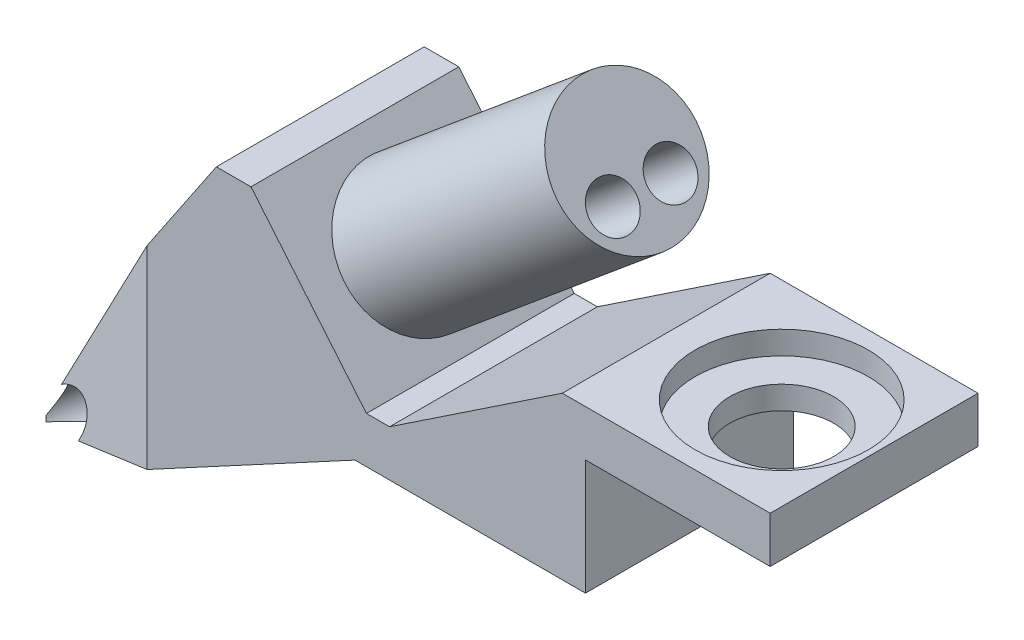
ISO-10303-21;
HEADER;
FILE_DESCRIPTION(('STEP AP214'),'2;1');
FILE_NAME('part.step','',(''),(''),'','','');
FILE_SCHEMA(('AUTOMOTIVE_DESIGN { 1 0 10303 214 1 1 1 1 }'));
ENDSEC;
DATA;
#1=APPLICATION_CONTEXT('core data for automotive mechanical design processes');
#2=APPLICATION_PROTOCOL_DEFINITION('international standard','automotive_design',2000,#1);
#3=PRODUCT_CONTEXT('',#1,'mechanical');
#4=PRODUCT('Part','Part','',(#3));
#5=PRODUCT_RELATED_PRODUCT_CATEGORY('part','',(#4));
#6=PRODUCT_DEFINITION_FORMATION('','',#4);
#7=PRODUCT_DEFINITION_CONTEXT('part definition',#1,'design');
#8=PRODUCT_DEFINITION('design','',#6,#7);
#9=PRODUCT_DEFINITION_SHAPE('','',#8);
#10=(LENGTH_UNIT() NAMED_UNIT(*) SI_UNIT(.MILLI.,.METRE.));
#11=(NAMED_UNIT(*) PLANE_ANGLE_UNIT() SI_UNIT($,.RADIAN.));
#12=(NAMED_UNIT(*) SI_UNIT($,.STERADIAN.) SOLID_ANGLE_UNIT());
#13=UNCERTAINTY_MEASURE_WITH_UNIT(LENGTH_MEASURE(1.E-05),#10,'distance_accuracy_value','');
#14=(GEOMETRIC_REPRESENTATION_CONTEXT(3) GLOBAL_UNCERTAINTY_ASSIGNED_CONTEXT((#13)) GLOBAL_UNIT_ASSIGNED_CONTEXT((#10,
#11,#12)) REPRESENTATION_CONTEXT('',''));
#15=CARTESIAN_POINT('',(0.,0.,0.));
#16=DIRECTION('',(0.,0.,1.));
#17=DIRECTION('',(1.,0.,0.));
#18=AXIS2_PLACEMENT_3D('',#15,#16,#17);
#19=CARTESIAN_POINT('',(31.6,0.,4.5));
#20=DIRECTION('',(0.,1.,0.));
#21=DIRECTION('',(0.,0.,1.));
#22=AXIS2_PLACEMENT_3D('',#19,#20,#21);
#23=CYLINDRICAL_SURFACE('',#22,2.25);
#24=CARTESIAN_POINT('',(31.6,14.5,4.5));
#25=DIRECTION('',(0.,1.,0.));
#26=DIRECTION('',(0.,0.,1.));
#27=AXIS2_PLACEMENT_3D('',#24,#25,#26);
#28=CIRCLE('',#27,2.25);
#29=CARTESIAN_POINT('',(31.6,14.5,6.75));
#30=VERTEX_POINT('',#29);
#31=EDGE_CURVE('E229',#30,#30,#28,.T.);
#32=ORIENTED_EDGE('',*,*,#31,.F.);
#33=EDGE_LOOP('',(#32));
#34=FACE_BOUND('',#33,.T.);
#35=CARTESIAN_POINT('',(31.6,15.5,4.5));
#36=DIRECTION('',(0.,1.,0.));
#37=DIRECTION('',(0.,0.,1.));
#38=AXIS2_PLACEMENT_3D('',#35,#36,#37);
#39=CIRCLE('',#38,2.25);
#40=CARTESIAN_POINT('',(31.6,15.5,6.75));
#41=VERTEX_POINT('',#40);
#42=EDGE_CURVE('E212',#41,#41,#39,.T.);
#43=ORIENTED_EDGE('',*,*,#42,.T.);
#44=EDGE_LOOP('',(#43));
#45=FACE_BOUND('',#44,.T.);
#46=ADVANCED_FACE('F48',(#34,#45),#23,.F.);
#47=CARTESIAN_POINT('',(0.,0.,9.));
#48=DIRECTION('',(1.,0.,0.));
#49=DIRECTION('',(0.,0.,-1.));
#50=AXIS2_PLACEMENT_3D('',#47,#48,#49);
#51=PLANE('',#50);
#52=DIRECTION('',(0.,0.,-1.));
#53=VECTOR('',#52,1.);
#54=CARTESIAN_POINT('',(0.,0.,9.));
#55=LINE('',#54,#53);
#56=CARTESIAN_POINT('',(0.,0.,4.75109455568454));
#57=VERTEX_POINT('',#56);
#58=CARTESIAN_POINT('',(0.,0.,4.24890544431546));
#59=VERTEX_POINT('',#58);
#60=EDGE_CURVE('E174',#57,#59,#55,.T.);
#61=ORIENTED_EDGE('',*,*,#60,.F.);
#62=CARTESIAN_POINT('',(0.,0.0608875813676938,5.75));
#63=DIRECTION('',(1.,0.,0.));
#64=DIRECTION('',(0.,1.,0.));
#65=AXIS2_PLACEMENT_3D('',#62,#63,#64);
#66=ELLIPSE('',#65,1.30170827931778,1.);
#67=CARTESIAN_POINT('',(0.,0.25,4.76060944613856));
#68=VERTEX_POINT('',#67);
#69=EDGE_CURVE('E206',#57,#68,#66,.T.);
#70=ORIENTED_EDGE('',*,*,#69,.T.);
#71=DIRECTION('',(0.,0.,-1.));
#72=VECTOR('',#71,1.);
#73=CARTESIAN_POINT('',(0.,0.25,9.));
#74=LINE('',#73,#72);
#75=CARTESIAN_POINT('',(0.,0.25,4.23939055386144));
#76=VERTEX_POINT('',#75);
#77=EDGE_CURVE('E176',#68,#76,#74,.T.);
#78=ORIENTED_EDGE('',*,*,#77,.T.);
#79=CARTESIAN_POINT('',(0.,0.0608875813676938,3.25));
#80=DIRECTION('',(1.,0.,0.));
#81=DIRECTION('',(0.,1.,0.));
#82=AXIS2_PLACEMENT_3D('',#79,#80,#81);
#83=ELLIPSE('',#82,1.30170827931778,1.);
#84=EDGE_CURVE('E164',#76,#59,#83,.T.);
#85=ORIENTED_EDGE('',*,*,#84,.T.);
#86=EDGE_LOOP('',(#61,#70,#78,#85));
#87=FACE_BOUND('',#86,.T.);
#88=ADVANCED_FACE('F50',(#87),#51,.F.);
#89=CARTESIAN_POINT('',(0.,0.,9.));
#90=DIRECTION('',(-0.474645573053964,0.880177016275859,0.));
#91=DIRECTION('',(-0.880177016275859,-0.474645573053964,0.));
#92=AXIS2_PLACEMENT_3D('',#89,#90,#91);
#93=PLANE('',#92);
#94=DIRECTION('',(0.814787559864974,0.439383557077732,0.378237124115283));
#95=VECTOR('',#94,1.);
#96=CARTESIAN_POINT('',(1.23273161363295,0.664764692050499,5.572253288236));
#97=LINE('',#96,#95);
#98=CARTESIAN_POINT('',(3.06593965426161,1.65334319942045,6.42325712205412));
#99=VERTEX_POINT('',#98);
#100=CARTESIAN_POINT('',(8.61668522645211,4.64664655121279,9.));
#101=VERTEX_POINT('',#100);
#102=EDGE_CURVE('E227',#99,#101,#97,.T.);
#103=ORIENTED_EDGE('',*,*,#102,.F.);
#104=CARTESIAN_POINT('',(-0.207050024136444,-0.111654105412676,5.75));
#105=DIRECTION('',(-0.474645573053964,0.880177016275859,0.));
#106=DIRECTION('',(0.880177016275859,0.474645573053964,0.));
#107=AXIS2_PLACEMENT_3D('',#104,#105,#106);
#108=ELLIPSE('',#107,5.02909924135544,1.);
#109=EDGE_CURVE('E73',#99,#57,#108,.T.);
#110=ORIENTED_EDGE('',*,*,#109,.T.);
#111=ORIENTED_EDGE('',*,*,#60,.T.);
#112=CARTESIAN_POINT('',(-0.207050024136444,-0.111654105412676,3.25));
#113=DIRECTION('',(-0.474645573053964,0.880177016275859,0.));
#114=DIRECTION('',(0.880177016275859,0.474645573053964,0.));
#115=AXIS2_PLACEMENT_3D('',#112,#113,#114);
#116=ELLIPSE('',#115,5.02909924135545,1.);
#117=CARTESIAN_POINT('',(3.06593965426161,1.65334319942045,2.57674287794588));
#118=VERTEX_POINT('',#117);
#119=EDGE_CURVE('E161',#59,#118,#116,.T.);
#120=ORIENTED_EDGE('',*,*,#119,.T.);
#121=DIRECTION('',(0.814787559864974,0.439383557077732,-0.378237124115283));
#122=VECTOR('',#121,1.);
#123=CARTESIAN_POINT('',(-1.54091451704119,-0.830955865063124,4.715316610295));
#124=LINE('',#123,#122);
#125=CARTESIAN_POINT('',(8.61668522645211,4.64664655121279,0.));
#126=VERTEX_POINT('',#125);
#127=EDGE_CURVE('E222',#118,#126,#124,.T.);
#128=ORIENTED_EDGE('',*,*,#127,.T.);
#129=DIRECTION('',(0.880177016275859,0.474645573053964,0.));
#130=VECTOR('',#129,1.);
#131=CARTESIAN_POINT('',(0.,0.,0.));
#132=LINE('',#131,#130);
#133=CARTESIAN_POINT('',(17.6166852264521,9.5,0.));
#134=VERTEX_POINT('',#133);
#135=EDGE_CURVE('E232',#126,#134,#132,.T.);
#136=ORIENTED_EDGE('',*,*,#135,.T.);
#137=DIRECTION('',(0.,0.,-1.));
#138=VECTOR('',#137,1.);
#139=CARTESIAN_POINT('',(17.6166852264521,9.5,9.));
#140=LINE('',#139,#138);
#141=CARTESIAN_POINT('',(17.6166852264521,9.5,9.));
#142=VERTEX_POINT('',#141);
#143=EDGE_CURVE('E181',#142,#134,#140,.T.);
#144=ORIENTED_EDGE('',*,*,#143,.F.);
#145=DIRECTION('',(0.880177016275859,0.474645573053964,0.));
#146=VECTOR('',#145,1.);
#147=CARTESIAN_POINT('',(0.,0.,9.));
#148=LINE('',#147,#146);
#149=EDGE_CURVE('E233',#101,#142,#148,.T.);
#150=ORIENTED_EDGE('',*,*,#149,.F.);
#151=EDGE_LOOP('',(#103,#110,#111,#120,#128,#136,#144,#150));
#152=FACE_BOUND('',#151,.T.);
#153=ADVANCED_FACE('F179',(#152),#93,.F.);
#154=CARTESIAN_POINT('',(11.6166852264521,17.5,9.));
#155=DIRECTION('',(0.829451668795888,-0.558578489678681,0.));
#156=DIRECTION('',(0.558578489678681,0.829451668795888,0.));
#157=AXIS2_PLACEMENT_3D('',#154,#155,#156);
#158=PLANE('',#157);
#159=ORIENTED_EDGE('',*,*,#77,.F.);
#160=CARTESIAN_POINT('',(-0.29022789513742,-0.180968997913489,5.75));
#161=DIRECTION('',(0.829451668795888,-0.558578489678681,0.));
#162=DIRECTION('',(0.558578489678681,0.829451668795888,0.));
#163=AXIS2_PLACEMENT_3D('',#160,#161,#162);
#164=ELLIPSE('',#163,3.57642039485892,1.);
#165=CARTESIAN_POINT('',(1.70573518411173,2.78290257524811,5.79182894084391));
#166=VERTEX_POINT('',#165);
#167=EDGE_CURVE('E202',#68,#166,#164,.T.);
#168=ORIENTED_EDGE('',*,*,#167,.T.);
#169=DIRECTION('',(-0.540696779594401,-0.802898526230621,-0.250999898631335));
#170=VECTOR('',#169,1.);
#171=CARTESIAN_POINT('',(11.4276823791133,17.2193434225823,10.3049088269033));
#172=LINE('',#171,#170);
#173=CARTESIAN_POINT('',(8.61668522645211,13.0452008046012,9.));
#174=VERTEX_POINT('',#173);
#175=EDGE_CURVE('E224',#174,#166,#172,.T.);
#176=ORIENTED_EDGE('',*,*,#175,.F.);
#177=DIRECTION('',(-0.558578489678681,-0.829451668795888,0.));
#178=VECTOR('',#177,1.);
#179=CARTESIAN_POINT('',(11.6166852264521,17.5,9.));
#180=LINE('',#179,#178);
#181=CARTESIAN_POINT('',(11.6166852264521,17.5,9.));
#182=VERTEX_POINT('',#181);
#183=EDGE_CURVE('E254',#182,#174,#180,.T.);
#184=ORIENTED_EDGE('',*,*,#183,.F.);
#185=DIRECTION('',(0.,0.,-1.));
#186=VECTOR('',#185,1.);
#187=CARTESIAN_POINT('',(11.6166852264521,17.5,9.));
#188=LINE('',#187,#186);
#189=CARTESIAN_POINT('',(11.6166852264521,17.5,0.));
#190=VERTEX_POINT('',#189);
#191=EDGE_CURVE('E280',#182,#190,#188,.T.);
#192=ORIENTED_EDGE('',*,*,#191,.T.);
#193=DIRECTION('',(-0.558578489678681,-0.829451668795888,0.));
#194=VECTOR('',#193,1.);
#195=CARTESIAN_POINT('',(11.6166852264521,17.5,0.));
#196=LINE('',#195,#194);
#197=CARTESIAN_POINT('',(8.61668522645212,13.0452008046012,0.));
#198=VERTEX_POINT('',#197);
#199=EDGE_CURVE('E236',#190,#198,#196,.T.);
#200=ORIENTED_EDGE('',*,*,#199,.T.);
#201=DIRECTION('',(-0.540696779594401,-0.802898526230621,0.250999898631335));
#202=VECTOR('',#201,1.);
#203=CARTESIAN_POINT('',(10.2062488472969,15.4055963843261,-0.737900284886843));
#204=LINE('',#203,#202);
#205=CARTESIAN_POINT('',(1.70573518411173,2.78290257524812,3.20817105915609));
#206=VERTEX_POINT('',#205);
#207=EDGE_CURVE('E218',#198,#206,#204,.T.);
#208=ORIENTED_EDGE('',*,*,#207,.T.);
#209=CARTESIAN_POINT('',(-0.29022789513742,-0.180968997913489,3.25));
#210=DIRECTION('',(0.829451668795888,-0.558578489678681,0.));
#211=DIRECTION('',(0.558578489678681,0.829451668795888,0.));
#212=AXIS2_PLACEMENT_3D('',#209,#210,#211);
#213=ELLIPSE('',#212,3.57642039485892,1.);
#214=EDGE_CURVE('E65',#206,#76,#213,.T.);
#215=ORIENTED_EDGE('',*,*,#214,.T.);
#216=EDGE_LOOP('',(#159,#168,#176,#184,#192,#200,#208,#215));
#217=FACE_BOUND('',#216,.T.);
#218=ADVANCED_FACE('F338',(#217),#158,.F.);
#219=CARTESIAN_POINT('',(0.,0.,9.));
#220=DIRECTION('',(0.,0.,1.));
#221=DIRECTION('',(1.,0.,0.));
#222=AXIS2_PLACEMENT_3D('',#219,#220,#221);
#223=PLANE('',#222);
#224=ORIENTED_EDGE('',*,*,#183,.T.);
#225=DIRECTION('',(0.,-1.,0.));
#226=VECTOR('',#225,1.);
#227=CARTESIAN_POINT('',(8.61668522645211,0.,9.));
#228=LINE('',#227,#226);
#229=EDGE_CURVE('E57',#174,#101,#228,.T.);
#230=ORIENTED_EDGE('',*,*,#229,.T.);
#231=ORIENTED_EDGE('',*,*,#149,.T.);
#232=DIRECTION('',(1.,0.,0.));
#233=VECTOR('',#232,1.);
#234=CARTESIAN_POINT('',(17.6166852264521,9.5,9.));
#235=LINE('',#234,#233);
#236=CARTESIAN_POINT('',(27.6,9.5,9.));
#237=VERTEX_POINT('',#236);
#238=EDGE_CURVE('E235',#142,#237,#235,.T.);
#239=ORIENTED_EDGE('',*,*,#238,.T.);
#240=DIRECTION('',(0.,1.,0.));
#241=VECTOR('',#240,1.);
#242=CARTESIAN_POINT('',(27.6,9.5,9.));
#243=LINE('',#242,#241);
#244=CARTESIAN_POINT('',(27.6,14.5,9.));
#245=VERTEX_POINT('',#244);
#246=EDGE_CURVE('E238',#237,#245,#243,.T.);
#247=ORIENTED_EDGE('',*,*,#246,.T.);
#248=DIRECTION('',(1.,0.,0.));
#249=VECTOR('',#248,1.);
#250=CARTESIAN_POINT('',(27.6,14.5,9.));
#251=LINE('',#250,#249);
#252=CARTESIAN_POINT('',(35.6,14.5,9.));
#253=VERTEX_POINT('',#252);
#254=EDGE_CURVE('E240',#245,#253,#251,.T.);
#255=ORIENTED_EDGE('',*,*,#254,.T.);
#256=DIRECTION('',(0.,1.,0.));
#257=VECTOR('',#256,1.);
#258=CARTESIAN_POINT('',(35.6,14.5,9.));
#259=LINE('',#258,#257);
#260=CARTESIAN_POINT('',(35.6,16.5,9.));
#261=VERTEX_POINT('',#260);
#262=EDGE_CURVE('E242',#253,#261,#259,.T.);
#263=ORIENTED_EDGE('',*,*,#262,.T.);
#264=DIRECTION('',(-1.,0.,0.));
#265=VECTOR('',#264,1.);
#266=CARTESIAN_POINT('',(35.6,16.5,9.));
#267=LINE('',#266,#265);
#268=CARTESIAN_POINT('',(26.6,16.5,9.));
#269=VERTEX_POINT('',#268);
#270=EDGE_CURVE('E244',#261,#269,#267,.T.);
#271=ORIENTED_EDGE('',*,*,#270,.T.);
#272=DIRECTION('',(-0.831479419283098,-0.555555555555556,0.));
#273=VECTOR('',#272,1.);
#274=CARTESIAN_POINT('',(26.6,16.5,9.));
#275=LINE('',#274,#273);
#276=CARTESIAN_POINT('',(19.1166852264521,11.5,9.));
#277=VERTEX_POINT('',#276);
#278=EDGE_CURVE('E246',#269,#277,#275,.T.);
#279=ORIENTED_EDGE('',*,*,#278,.T.);
#280=DIRECTION('',(-1.,0.,0.));
#281=VECTOR('',#280,1.);
#282=CARTESIAN_POINT('',(19.1166852264521,11.5,9.));
#283=LINE('',#282,#281);
#284=CARTESIAN_POINT('',(18.1166852264521,11.5,9.));
#285=VERTEX_POINT('',#284);
#286=EDGE_CURVE('E248',#277,#285,#283,.T.);
#287=ORIENTED_EDGE('',*,*,#286,.T.);
#288=DIRECTION('',(-0.64018439966448,0.768221279597376,0.));
#289=VECTOR('',#288,1.);
#290=CARTESIAN_POINT('',(18.1166852264521,11.5,9.));
#291=LINE('',#290,#289);
#292=CARTESIAN_POINT('',(13.1166852264521,17.5,9.));
#293=VERTEX_POINT('',#292);
#294=EDGE_CURVE('E250',#285,#293,#291,.T.);
#295=ORIENTED_EDGE('',*,*,#294,.T.);
#296=DIRECTION('',(-1.,0.,0.));
#297=VECTOR('',#296,1.);
#298=CARTESIAN_POINT('',(13.1166852264521,17.5,9.));
#299=LINE('',#298,#297);
#300=EDGE_CURVE('E252',#293,#182,#299,.T.);
#301=ORIENTED_EDGE('',*,*,#300,.T.);
#302=EDGE_LOOP('',(#224,#230,#231,#239,#247,#255,#263,#271,#279,#287,#295,#301));
#303=FACE_BOUND('',#302,.T.);
#304=ADVANCED_FACE('F329',(#303),#223,.T.);
#305=CARTESIAN_POINT('',(17.6166852264521,9.5,9.));
#306=DIRECTION('',(0.,1.,0.));
#307=DIRECTION('',(0.,0.,1.));
#308=AXIS2_PLACEMENT_3D('',#305,#306,#307);
#309=PLANE('',#308);
#310=DIRECTION('',(1.,0.,0.));
#311=VECTOR('',#310,1.);
#312=CARTESIAN_POINT('',(17.6166852264521,9.5,0.));
#313=LINE('',#312,#311);
#314=CARTESIAN_POINT('',(27.6,9.5,0.));
#315=VERTEX_POINT('',#314);
#316=EDGE_CURVE('E258',#134,#315,#313,.T.);
#317=ORIENTED_EDGE('',*,*,#316,.T.);
#318=DIRECTION('',(0.,0.,-1.));
#319=VECTOR('',#318,1.);
#320=CARTESIAN_POINT('',(27.6,9.5,9.));
#321=LINE('',#320,#319);
#322=EDGE_CURVE('E186',#237,#315,#321,.T.);
#323=ORIENTED_EDGE('',*,*,#322,.F.);
#324=ORIENTED_EDGE('',*,*,#238,.F.);
#325=ORIENTED_EDGE('',*,*,#143,.T.);
#326=EDGE_LOOP('',(#317,#323,#324,#325));
#327=FACE_BOUND('',#326,.T.);
#328=ADVANCED_FACE('F333',(#327),#309,.F.);
#329=CARTESIAN_POINT('',(27.6,9.5,9.));
#330=DIRECTION('',(-1.,0.,0.));
#331=DIRECTION('',(0.,0.,1.));
#332=AXIS2_PLACEMENT_3D('',#329,#330,#331);
#333=PLANE('',#332);
#334=DIRECTION('',(0.,1.,0.));
#335=VECTOR('',#334,1.);
#336=CARTESIAN_POINT('',(27.6,9.5,0.));
#337=LINE('',#336,#335);
#338=CARTESIAN_POINT('',(27.6,14.5,0.));
#339=VERTEX_POINT('',#338);
#340=EDGE_CURVE('E260',#315,#339,#337,.T.);
#341=ORIENTED_EDGE('',*,*,#340,.T.);
#342=DIRECTION('',(0.,0.,-1.));
#343=VECTOR('',#342,1.);
#344=CARTESIAN_POINT('',(27.6,14.5,9.));
#345=LINE('',#344,#343);
#346=EDGE_CURVE('E301',#245,#339,#345,.T.);
#347=ORIENTED_EDGE('',*,*,#346,.F.);
#348=ORIENTED_EDGE('',*,*,#246,.F.);
#349=ORIENTED_EDGE('',*,*,#322,.T.);
#350=EDGE_LOOP('',(#341,#347,#348,#349));
#351=FACE_BOUND('',#350,.T.);
#352=ADVANCED_FACE('F308',(#351),#333,.F.);
#353=CARTESIAN_POINT('',(27.6,14.5,9.));
#354=DIRECTION('',(0.,1.,0.));
#355=DIRECTION('',(0.,0.,1.));
#356=AXIS2_PLACEMENT_3D('',#353,#354,#355);
#357=PLANE('',#356);
#358=ORIENTED_EDGE('',*,*,#31,.T.);
#359=EDGE_LOOP('',(#358));
#360=FACE_BOUND('',#359,.T.);
#361=DIRECTION('',(1.,0.,0.));
#362=VECTOR('',#361,1.);
#363=CARTESIAN_POINT('',(27.6,14.5,0.));
#364=LINE('',#363,#362);
#365=CARTESIAN_POINT('',(35.6,14.5,0.));
#366=VERTEX_POINT('',#365);
#367=EDGE_CURVE('E262',#339,#366,#364,.T.);
#368=ORIENTED_EDGE('',*,*,#367,.T.);
#369=DIRECTION('',(0.,0.,-1.));
#370=VECTOR('',#369,1.);
#371=CARTESIAN_POINT('',(35.6,14.5,9.));
#372=LINE('',#371,#370);
#373=EDGE_CURVE('E298',#253,#366,#372,.T.);
#374=ORIENTED_EDGE('',*,*,#373,.F.);
#375=ORIENTED_EDGE('',*,*,#254,.F.);
#376=ORIENTED_EDGE('',*,*,#346,.T.);
#377=EDGE_LOOP('',(#368,#374,#375,#376));
#378=FACE_BOUND('',#377,.T.);
#379=ADVANCED_FACE('F321',(#360,#378),#357,.F.);
#380=CARTESIAN_POINT('',(35.6,14.5,9.));
#381=DIRECTION('',(-1.,0.,0.));
#382=DIRECTION('',(0.,0.,1.));
#383=AXIS2_PLACEMENT_3D('',#380,#381,#382);
#384=PLANE('',#383);
#385=DIRECTION('',(0.,1.,0.));
#386=VECTOR('',#385,1.);
#387=CARTESIAN_POINT('',(35.6,14.5,0.));
#388=LINE('',#387,#386);
#389=CARTESIAN_POINT('',(35.6,16.5,0.));
#390=VERTEX_POINT('',#389);
#391=EDGE_CURVE('E264',#366,#390,#388,.T.);
#392=ORIENTED_EDGE('',*,*,#391,.T.);
#393=DIRECTION('',(0.,0.,-1.));
#394=VECTOR('',#393,1.);
#395=CARTESIAN_POINT('',(35.6,16.5,9.));
#396=LINE('',#395,#394);
#397=EDGE_CURVE('E295',#261,#390,#396,.T.);
#398=ORIENTED_EDGE('',*,*,#397,.F.);
#399=ORIENTED_EDGE('',*,*,#262,.F.);
#400=ORIENTED_EDGE('',*,*,#373,.T.);
#401=EDGE_LOOP('',(#392,#398,#399,#400));
#402=FACE_BOUND('',#401,.T.);
#403=ADVANCED_FACE('F325',(#402),#384,.F.);
#404=CARTESIAN_POINT('',(35.6,16.5,9.));
#405=DIRECTION('',(0.,-1.,0.));
#406=DIRECTION('',(0.,0.,-1.));
#407=AXIS2_PLACEMENT_3D('',#404,#405,#406);
#408=PLANE('',#407);
#409=CARTESIAN_POINT('',(31.6,16.5,4.5));
#410=DIRECTION('',(0.,1.,0.));
#411=DIRECTION('',(0.,0.,1.));
#412=AXIS2_PLACEMENT_3D('',#409,#410,#411);
#413=CIRCLE('',#412,3.75000000000001);
#414=CARTESIAN_POINT('',(31.6,16.5,8.25000000000001));
#415=VERTEX_POINT('',#414);
#416=EDGE_CURVE('E211',#415,#415,#413,.T.);
#417=ORIENTED_EDGE('',*,*,#416,.F.);
#418=EDGE_LOOP('',(#417));
#419=FACE_BOUND('',#418,.T.);
#420=DIRECTION('',(-1.,0.,0.));
#421=VECTOR('',#420,1.);
#422=CARTESIAN_POINT('',(35.6,16.5,0.));
#423=LINE('',#422,#421);
#424=CARTESIAN_POINT('',(26.6,16.5,0.));
#425=VERTEX_POINT('',#424);
#426=EDGE_CURVE('E265',#390,#425,#423,.T.);
#427=ORIENTED_EDGE('',*,*,#426,.T.);
#428=DIRECTION('',(0.,0.,-1.));
#429=VECTOR('',#428,1.);
#430=CARTESIAN_POINT('',(26.6,16.5,9.));
#431=LINE('',#430,#429);
#432=EDGE_CURVE('E292',#269,#425,#431,.T.);
#433=ORIENTED_EDGE('',*,*,#432,.F.);
#434=ORIENTED_EDGE('',*,*,#270,.F.);
#435=ORIENTED_EDGE('',*,*,#397,.T.);
#436=EDGE_LOOP('',(#427,#433,#434,#435));
#437=FACE_BOUND('',#436,.T.);
#438=ADVANCED_FACE('F361',(#419,#437),#408,.F.);
#439=CARTESIAN_POINT('',(26.6,16.5,9.));
#440=DIRECTION('',(0.555555555555556,-0.831479419283098,0.));
#441=DIRECTION('',(0.831479419283098,0.555555555555556,0.));
#442=AXIS2_PLACEMENT_3D('',#439,#440,#441);
#443=PLANE('',#442);
#444=DIRECTION('',(-0.831479419283098,-0.555555555555556,0.));
#445=VECTOR('',#444,1.);
#446=CARTESIAN_POINT('',(26.6,16.5,0.));
#447=LINE('',#446,#445);
#448=CARTESIAN_POINT('',(19.1166852264521,11.5,0.));
#449=VERTEX_POINT('',#448);
#450=EDGE_CURVE('E269',#425,#449,#447,.T.);
#451=ORIENTED_EDGE('',*,*,#450,.T.);
#452=DIRECTION('',(0.,0.,-1.));
#453=VECTOR('',#452,1.);
#454=CARTESIAN_POINT('',(19.1166852264521,11.5,9.));
#455=LINE('',#454,#453);
#456=EDGE_CURVE('E289',#277,#449,#455,.T.);
#457=ORIENTED_EDGE('',*,*,#456,.F.);
#458=ORIENTED_EDGE('',*,*,#278,.F.);
#459=ORIENTED_EDGE('',*,*,#432,.T.);
#460=EDGE_LOOP('',(#451,#457,#458,#459));
#461=FACE_BOUND('',#460,.T.);
#462=ADVANCED_FACE('F359',(#461),#443,.F.);
#463=CARTESIAN_POINT('',(19.1166852264521,11.5,9.));
#464=DIRECTION('',(0.,-1.,0.));
#465=DIRECTION('',(0.,0.,-1.));
#466=AXIS2_PLACEMENT_3D('',#463,#464,#465);
#467=PLANE('',#466);
#468=DIRECTION('',(-1.,0.,0.));
#469=VECTOR('',#468,1.);
#470=CARTESIAN_POINT('',(19.1166852264521,11.5,0.));
#471=LINE('',#470,#469);
#472=CARTESIAN_POINT('',(18.1166852264521,11.5,0.));
#473=VERTEX_POINT('',#472);
#474=EDGE_CURVE('E271',#449,#473,#471,.T.);
#475=ORIENTED_EDGE('',*,*,#474,.T.);
#476=DIRECTION('',(0.,0.,-1.));
#477=VECTOR('',#476,1.);
#478=CARTESIAN_POINT('',(18.1166852264521,11.5,9.));
#479=LINE('',#478,#477);
#480=EDGE_CURVE('E286',#285,#473,#479,.T.);
#481=ORIENTED_EDGE('',*,*,#480,.F.);
#482=ORIENTED_EDGE('',*,*,#286,.F.);
#483=ORIENTED_EDGE('',*,*,#456,.T.);
#484=EDGE_LOOP('',(#475,#481,#482,#483));
#485=FACE_BOUND('',#484,.T.);
#486=ADVANCED_FACE('F355',(#485),#467,.F.);
#487=CARTESIAN_POINT('',(18.1166852264521,11.5,9.));
#488=DIRECTION('',(-0.768221279597376,-0.64018439966448,0.));
#489=DIRECTION('',(0.64018439966448,-0.768221279597376,0.));
#490=AXIS2_PLACEMENT_3D('',#487,#488,#489);
#491=PLANE('',#490);
#492=CARTESIAN_POINT('',(15.67742282511,14.4271148816105,4.5));
#493=DIRECTION('',(-0.768221279597376,-0.64018439966448,0.));
#494=DIRECTION('',(0.64018439966448,-0.768221279597376,0.));
#495=AXIS2_PLACEMENT_3D('',#492,#493,#494);
#496=CIRCLE('',#495,3.);
#497=CARTESIAN_POINT('',(17.5979760241035,12.1224510428184,4.5));
#498=VERTEX_POINT('',#497);
#499=EDGE_CURVE('E12',#498,#498,#496,.F.);
#500=ORIENTED_EDGE('',*,*,#499,.F.);
#501=EDGE_LOOP('',(#500));
#502=FACE_BOUND('',#501,.T.);
#503=DIRECTION('',(-0.64018439966448,0.768221279597376,0.));
#504=VECTOR('',#503,1.);
#505=CARTESIAN_POINT('',(18.1166852264521,11.5,0.));
#506=LINE('',#505,#504);
#507=CARTESIAN_POINT('',(13.1166852264521,17.5,0.));
#508=VERTEX_POINT('',#507);
#509=EDGE_CURVE('E273',#473,#508,#506,.T.);
#510=ORIENTED_EDGE('',*,*,#509,.T.);
#511=DIRECTION('',(0.,0.,-1.));
#512=VECTOR('',#511,1.);
#513=CARTESIAN_POINT('',(13.1166852264521,17.5,9.));
#514=LINE('',#513,#512);
#515=EDGE_CURVE('E283',#293,#508,#514,.T.);
#516=ORIENTED_EDGE('',*,*,#515,.F.);
#517=ORIENTED_EDGE('',*,*,#294,.F.);
#518=ORIENTED_EDGE('',*,*,#480,.T.);
#519=EDGE_LOOP('',(#510,#516,#517,#518));
#520=FACE_BOUND('',#519,.T.);
#521=ADVANCED_FACE('F350',(#502,#520),#491,.F.);
#522=CARTESIAN_POINT('',(13.1166852264521,17.5,9.));
#523=DIRECTION('',(0.,-1.,0.));
#524=DIRECTION('',(0.,0.,-1.));
#525=AXIS2_PLACEMENT_3D('',#522,#523,#524);
#526=PLANE('',#525);
#527=DIRECTION('',(-1.,0.,0.));
#528=VECTOR('',#527,1.);
#529=CARTESIAN_POINT('',(13.1166852264521,17.5,0.));
#530=LINE('',#529,#528);
#531=EDGE_CURVE('E275',#508,#190,#530,.T.);
#532=ORIENTED_EDGE('',*,*,#531,.T.);
#533=ORIENTED_EDGE('',*,*,#191,.F.);
#534=ORIENTED_EDGE('',*,*,#300,.F.);
#535=ORIENTED_EDGE('',*,*,#515,.T.);
#536=EDGE_LOOP('',(#532,#533,#534,#535));
#537=FACE_BOUND('',#536,.T.);
#538=ADVANCED_FACE('F344',(#537),#526,.F.);
#539=CARTESIAN_POINT('',(0.,0.,0.));
#540=DIRECTION('',(0.,0.,1.));
#541=DIRECTION('',(1.,0.,0.));
#542=AXIS2_PLACEMENT_3D('',#539,#540,#541);
#543=PLANE('',#542);
#544=ORIENTED_EDGE('',*,*,#135,.F.);
#545=DIRECTION('',(0.,1.,0.));
#546=VECTOR('',#545,1.);
#547=CARTESIAN_POINT('',(8.61668522645211,0.,0.));
#548=LINE('',#547,#546);
#549=EDGE_CURVE('E180',#126,#198,#548,.T.);
#550=ORIENTED_EDGE('',*,*,#549,.T.);
#551=ORIENTED_EDGE('',*,*,#199,.F.);
#552=ORIENTED_EDGE('',*,*,#531,.F.);
#553=ORIENTED_EDGE('',*,*,#509,.F.);
#554=ORIENTED_EDGE('',*,*,#474,.F.);
#555=ORIENTED_EDGE('',*,*,#450,.F.);
#556=ORIENTED_EDGE('',*,*,#426,.F.);
#557=ORIENTED_EDGE('',*,*,#391,.F.);
#558=ORIENTED_EDGE('',*,*,#367,.F.);
#559=ORIENTED_EDGE('',*,*,#340,.F.);
#560=ORIENTED_EDGE('',*,*,#316,.F.);
#561=EDGE_LOOP('',(#544,#550,#551,#552,#553,#554,#555,#556,#557,#558,#559,#560));
#562=FACE_BOUND('',#561,.T.);
#563=ADVANCED_FACE('F316',(#562),#543,.F.);
#564=CARTESIAN_POINT('',(1.52765809252153,0.,3.29083722922508));
#565=DIRECTION('',(0.421059013314916,0.,0.907033244873786));
#566=DIRECTION('',(0.907033244873786,0.,-0.421059013314916));
#567=AXIS2_PLACEMENT_3D('',#564,#565,#566);
#568=PLANE('',#567);
#569=ORIENTED_EDGE('',*,*,#127,.F.);
#570=CARTESIAN_POINT('',(1.61562847995977,1.40724464800084,3.25));
#571=DIRECTION('',(0.421059013314916,0.,0.907033244873786));
#572=DIRECTION('',(0.667931019087817,0.676556321449239,-0.310064021852559));
#573=AXIS2_PLACEMENT_3D('',#570,#571,#572);
#574=ELLIPSE('',#573,3.09151030652373,1.);
#575=EDGE_CURVE('E165',#118,#206,#574,.T.);
#576=ORIENTED_EDGE('',*,*,#575,.T.);
#577=ORIENTED_EDGE('',*,*,#207,.F.);
#578=ORIENTED_EDGE('',*,*,#549,.F.);
#579=EDGE_LOOP('',(#569,#576,#577,#578));
#580=FACE_BOUND('',#579,.T.);
#581=ADVANCED_FACE('F384',(#580),#568,.F.);
#582=CARTESIAN_POINT('',(-1.90957261565192,0.,4.11354653653135));
#583=DIRECTION('',(-0.421059013314916,0.,0.907033244873786));
#584=DIRECTION('',(0.907033244873786,0.,0.421059013314916));
#585=AXIS2_PLACEMENT_3D('',#582,#583,#584);
#586=PLANE('',#585);
#587=CARTESIAN_POINT('',(1.61562847995977,1.40724464800084,5.75));
#588=DIRECTION('',(-0.421059013314916,0.,0.907033244873786));
#589=DIRECTION('',(0.667931019087817,0.676556321449239,0.310064021852559));
#590=AXIS2_PLACEMENT_3D('',#587,#588,#589);
#591=ELLIPSE('',#590,3.09151030652373,1.);
#592=EDGE_CURVE('E200',#99,#166,#591,.T.);
#593=ORIENTED_EDGE('',*,*,#592,.F.);
#594=ORIENTED_EDGE('',*,*,#102,.T.);
#595=ORIENTED_EDGE('',*,*,#229,.F.);
#596=ORIENTED_EDGE('',*,*,#175,.T.);
#597=EDGE_LOOP('',(#593,#594,#595,#596));
#598=FACE_BOUND('',#597,.T.);
#599=ADVANCED_FACE('F387',(#598),#586,.T.);
#600=CARTESIAN_POINT('',(31.6,15.5,4.5));
#601=DIRECTION('',(0.,1.,0.));
#602=DIRECTION('',(0.,0.,1.));
#603=AXIS2_PLACEMENT_3D('',#600,#601,#602);
#604=CYLINDRICAL_SURFACE('',#603,3.75000000000001);
#605=CARTESIAN_POINT('',(31.6,15.5,4.5));
#606=DIRECTION('',(0.,1.,0.));
#607=DIRECTION('',(0.,0.,1.));
#608=AXIS2_PLACEMENT_3D('',#605,#606,#607);
#609=CIRCLE('',#608,3.75000000000001);
#610=CARTESIAN_POINT('',(31.6,15.5,8.25000000000001));
#611=VERTEX_POINT('',#610);
#612=EDGE_CURVE('E215',#611,#611,#609,.T.);
#613=ORIENTED_EDGE('',*,*,#612,.F.);
#614=EDGE_LOOP('',(#613));
#615=FACE_BOUND('',#614,.T.);
#616=ORIENTED_EDGE('',*,*,#416,.T.);
#617=EDGE_LOOP('',(#616));
#618=FACE_BOUND('',#617,.T.);
#619=ADVANCED_FACE('F382',(#615,#618),#604,.F.);
#620=CARTESIAN_POINT('',(0.,15.5,0.));
#621=DIRECTION('',(0.,1.,0.));
#622=DIRECTION('',(0.,0.,1.));
#623=AXIS2_PLACEMENT_3D('',#620,#621,#622);
#624=PLANE('',#623);
#625=ORIENTED_EDGE('',*,*,#42,.F.);
#626=EDGE_LOOP('',(#625));
#627=FACE_BOUND('',#626,.T.);
#628=ORIENTED_EDGE('',*,*,#612,.T.);
#629=EDGE_LOOP('',(#628));
#630=FACE_BOUND('',#629,.T.);
#631=ADVANCED_FACE('F429',(#627,#630),#624,.T.);
#632=CARTESIAN_POINT('',(24.8960781802786,22.1093276775843,4.5));
#633=DIRECTION('',(-0.768221279597376,-0.64018439966448,0.));
#634=DIRECTION('',(0.64018439966448,-0.768221279597376,0.));
#635=AXIS2_PLACEMENT_3D('',#632,#633,#634);
#636=CYLINDRICAL_SURFACE('',#635,3.);
#637=CARTESIAN_POINT('',(24.8960781802786,22.1093276775843,4.5));
#638=DIRECTION('',(0.768221279597376,0.64018439966448,0.));
#639=DIRECTION('',(-0.64018439966448,0.768221279597376,0.));
#640=AXIS2_PLACEMENT_3D('',#637,#638,#639);
#641=CIRCLE('',#640,3.);
#642=CARTESIAN_POINT('',(22.9755249812851,24.4139915163764,4.5));
#643=VERTEX_POINT('',#642);
#644=EDGE_CURVE('E208',#643,#643,#641,.T.);
#645=ORIENTED_EDGE('',*,*,#644,.F.);
#646=EDGE_LOOP('',(#645));
#647=FACE_BOUND('',#646,.T.);
#648=ORIENTED_EDGE('',*,*,#499,.T.);
#649=EDGE_LOOP('',(#648));
#650=FACE_BOUND('',#649,.T.);
#651=ADVANCED_FACE('F438',(#647,#650),#636,.T.);
#652=CARTESIAN_POINT('',(24.8960781802786,22.1093276775843,4.5));
#653=DIRECTION('',(0.768221279597376,0.64018439966448,0.));
#654=DIRECTION('',(-0.64018439966448,0.768221279597376,0.));
#655=AXIS2_PLACEMENT_3D('',#652,#653,#654);
#656=PLANE('',#655);
#657=CARTESIAN_POINT('',(25.536262579943,21.3411063979869,5.75));
#658=DIRECTION('',(0.768221279597376,0.64018439966448,0.));
#659=DIRECTION('',(-0.64018439966448,0.768221279597376,0.));
#660=AXIS2_PLACEMENT_3D('',#657,#658,#659);
#661=CIRCLE('',#660,1.);
#662=CARTESIAN_POINT('',(24.8960781802786,22.1093276775843,5.75));
#663=VERTEX_POINT('',#662);
#664=EDGE_CURVE('E52',#663,#663,#661,.T.);
#665=ORIENTED_EDGE('',*,*,#664,.F.);
#666=EDGE_LOOP('',(#665));
#667=FACE_BOUND('',#666,.T.);
#668=CARTESIAN_POINT('',(25.536262579943,21.3411063979869,3.25));
#669=DIRECTION('',(0.768221279597376,0.64018439966448,0.));
#670=DIRECTION('',(-0.64018439966448,0.768221279597376,0.));
#671=AXIS2_PLACEMENT_3D('',#668,#669,#670);
#672=CIRCLE('',#671,1.);
#673=CARTESIAN_POINT('',(24.8960781802786,22.1093276775843,3.25));
#674=VERTEX_POINT('',#673);
#675=EDGE_CURVE('E191',#674,#674,#672,.T.);
#676=ORIENTED_EDGE('',*,*,#675,.F.);
#677=EDGE_LOOP('',(#676));
#678=FACE_BOUND('',#677,.T.);
#679=ORIENTED_EDGE('',*,*,#644,.T.);
#680=EDGE_LOOP('',(#679));
#681=FACE_BOUND('',#680,.T.);
#682=ADVANCED_FACE('F442',(#667,#678,#681),#656,.T.);
#683=CARTESIAN_POINT('',(-0.0299447121480494,0.0359336545776526,3.25));
#684=DIRECTION('',(0.768221279597376,0.64018439966448,0.));
#685=DIRECTION('',(-0.64018439966448,0.768221279597376,0.));
#686=AXIS2_PLACEMENT_3D('',#683,#684,#685);
#687=CYLINDRICAL_SURFACE('',#686,1.);
#688=ORIENTED_EDGE('',*,*,#675,.T.);
#689=EDGE_LOOP('',(#688));
#690=FACE_BOUND('',#689,.T.);
#691=ORIENTED_EDGE('',*,*,#214,.F.);
#692=ORIENTED_EDGE('',*,*,#575,.F.);
#693=ORIENTED_EDGE('',*,*,#119,.F.);
#694=ORIENTED_EDGE('',*,*,#84,.F.);
#695=EDGE_LOOP('',(#691,#692,#693,#694));
#696=FACE_BOUND('',#695,.T.);
#697=ADVANCED_FACE('F163',(#690,#696),#687,.F.);
#698=CARTESIAN_POINT('',(-0.0299447121480494,0.0359336545776526,5.75));
#699=DIRECTION('',(0.768221279597376,0.64018439966448,0.));
#700=DIRECTION('',(-0.64018439966448,0.768221279597376,0.));
#701=AXIS2_PLACEMENT_3D('',#698,#699,#700);
#702=CYLINDRICAL_SURFACE('',#701,1.);
#703=ORIENTED_EDGE('',*,*,#664,.T.);
#704=EDGE_LOOP('',(#703));
#705=FACE_BOUND('',#704,.T.);
#706=ORIENTED_EDGE('',*,*,#109,.F.);
#707=ORIENTED_EDGE('',*,*,#592,.T.);
#708=ORIENTED_EDGE('',*,*,#167,.F.);
#709=ORIENTED_EDGE('',*,*,#69,.F.);
#710=EDGE_LOOP('',(#706,#707,#708,#709));
#711=FACE_BOUND('',#710,.T.);
#712=ADVANCED_FACE('F456',(#705,#711),#702,.F.);
#713=CLOSED_SHELL('',(#46,#88,#153,#218,#304,#328,#352,#379,#403,#438,#462,#486,#521,#538,#563,
#581,#599,#619,#631,#651,#682,#697,#712));
#714=MANIFOLD_SOLID_BREP('B2',#713);
#715=ADVANCED_BREP_SHAPE_REPRESENTATION('',(#18,#714),#14);
#716=SHAPE_DEFINITION_REPRESENTATION(#9,#715);
ENDSEC;
END-ISO-10303-21;
